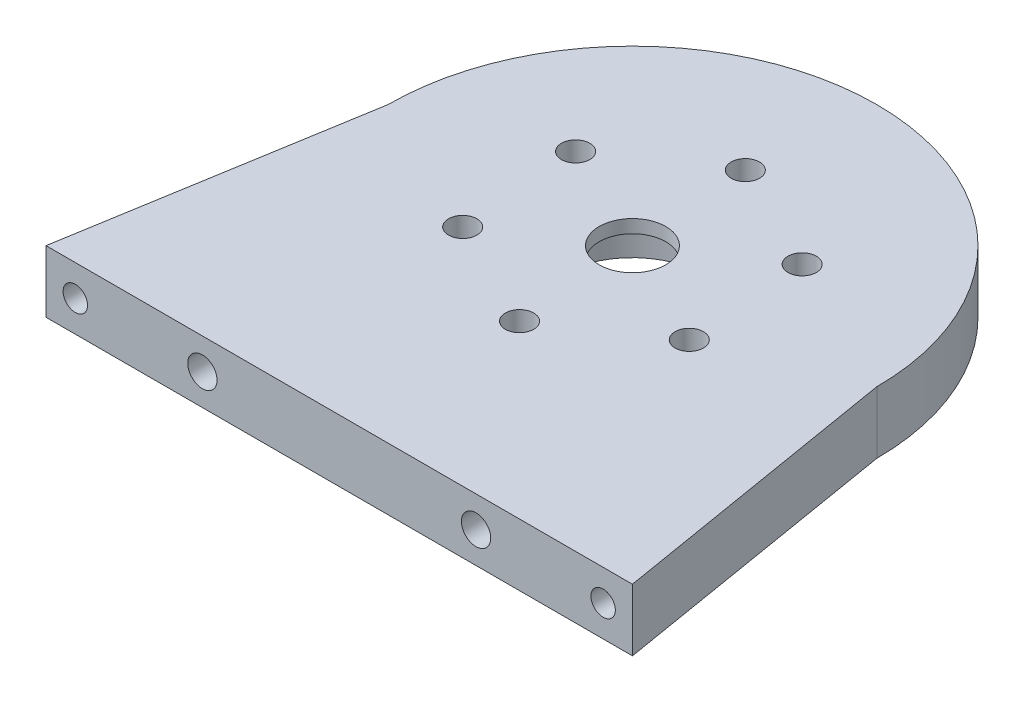
ISO-10303-21;
HEADER;
FILE_DESCRIPTION(('STEP AP214'),'2;1');
FILE_NAME('part.step','',(''),(''),'','','');
FILE_SCHEMA(('AUTOMOTIVE_DESIGN { 1 0 10303 214 1 1 1 1 }'));
ENDSEC;
DATA;
#1=APPLICATION_CONTEXT('core data for automotive mechanical design processes');
#2=APPLICATION_PROTOCOL_DEFINITION('international standard','automotive_design',2000,#1);
#3=PRODUCT_CONTEXT('',#1,'mechanical');
#4=PRODUCT('Part','Part','',(#3));
#5=PRODUCT_RELATED_PRODUCT_CATEGORY('part','',(#4));
#6=PRODUCT_DEFINITION_FORMATION('','',#4);
#7=PRODUCT_DEFINITION_CONTEXT('part definition',#1,'design');
#8=PRODUCT_DEFINITION('design','',#6,#7);
#9=PRODUCT_DEFINITION_SHAPE('','',#8);
#10=(LENGTH_UNIT() NAMED_UNIT(*) SI_UNIT(.MILLI.,.METRE.));
#11=(NAMED_UNIT(*) PLANE_ANGLE_UNIT() SI_UNIT($,.RADIAN.));
#12=(NAMED_UNIT(*) SI_UNIT($,.STERADIAN.) SOLID_ANGLE_UNIT());
#13=UNCERTAINTY_MEASURE_WITH_UNIT(LENGTH_MEASURE(1.E-05),#10,'distance_accuracy_value','');
#14=(GEOMETRIC_REPRESENTATION_CONTEXT(3) GLOBAL_UNCERTAINTY_ASSIGNED_CONTEXT((#13)) GLOBAL_UNIT_ASSIGNED_CONTEXT((#10,
#11,#12)) REPRESENTATION_CONTEXT('',''));
#15=CARTESIAN_POINT('',(0.,0.,0.));
#16=DIRECTION('',(0.,0.,1.));
#17=DIRECTION('',(1.,0.,0.));
#18=AXIS2_PLACEMENT_3D('',#15,#16,#17);
#19=CARTESIAN_POINT('',(152.4,3.175,336.55));
#20=DIRECTION('',(0.,-1.,0.));
#21=DIRECTION('',(0.,0.,-1.));
#22=AXIS2_PLACEMENT_3D('',#19,#20,#21);
#23=CYLINDRICAL_SURFACE('',#22,3.4);
#24=CARTESIAN_POINT('',(152.4,3.175,336.55));
#25=DIRECTION('',(0.,1.,0.));
#26=DIRECTION('',(0.,0.,1.));
#27=AXIS2_PLACEMENT_3D('',#24,#25,#26);
#28=CIRCLE('',#27,3.4);
#29=CARTESIAN_POINT('',(152.4,3.175,339.95));
#30=VERTEX_POINT('',#29);
#31=EDGE_CURVE('E139',#30,#30,#28,.T.);
#32=ORIENTED_EDGE('',*,*,#31,.T.);
#33=EDGE_LOOP('',(#32));
#34=FACE_BOUND('',#33,.T.);
#35=CARTESIAN_POINT('',(152.4,1.825,336.55));
#36=DIRECTION('',(0.,-1.,0.));
#37=DIRECTION('',(0.,0.,-1.));
#38=AXIS2_PLACEMENT_3D('',#35,#36,#37);
#39=CIRCLE('',#38,3.4);
#40=CARTESIAN_POINT('',(152.4,1.825,333.15));
#41=VERTEX_POINT('',#40);
#42=EDGE_CURVE('E43',#41,#41,#39,.T.);
#43=ORIENTED_EDGE('',*,*,#42,.T.);
#44=EDGE_LOOP('',(#43));
#45=FACE_BOUND('',#44,.T.);
#46=ADVANCED_FACE('F39',(#34,#45),#23,.F.);
#47=CARTESIAN_POINT('',(122.4,3.175,366.55));
#48=DIRECTION('',(0.986393923832144,0.,0.164398987305357));
#49=DIRECTION('',(0.164398987305357,0.,-0.986393923832144));
#50=AXIS2_PLACEMENT_3D('',#47,#48,#49);
#51=PLANE('',#50);
#52=DIRECTION('',(-0.164398987305357,0.,0.986393923832144));
#53=VECTOR('',#52,1.);
#54=CARTESIAN_POINT('',(122.4,-3.175,366.55));
#55=LINE('',#54,#53);
#56=CARTESIAN_POINT('',(127.4,-3.175,336.55));
#57=VERTEX_POINT('',#56);
#58=CARTESIAN_POINT('',(122.4,-3.175,366.55));
#59=VERTEX_POINT('',#58);
#60=EDGE_CURVE('E104',#57,#59,#55,.T.);
#61=ORIENTED_EDGE('',*,*,#60,.T.);
#62=DIRECTION('',(0.,-1.,0.));
#63=VECTOR('',#62,1.);
#64=CARTESIAN_POINT('',(122.4,3.175,366.55));
#65=LINE('',#64,#63);
#66=CARTESIAN_POINT('',(122.4,3.175,366.55));
#67=VERTEX_POINT('',#66);
#68=EDGE_CURVE('E11',#67,#59,#65,.T.);
#69=ORIENTED_EDGE('',*,*,#68,.F.);
#70=DIRECTION('',(-0.164398987305357,0.,0.986393923832144));
#71=VECTOR('',#70,1.);
#72=CARTESIAN_POINT('',(122.4,3.175,366.55));
#73=LINE('',#72,#71);
#74=CARTESIAN_POINT('',(127.4,3.175,336.55));
#75=VERTEX_POINT('',#74);
#76=EDGE_CURVE('E59',#75,#67,#73,.T.);
#77=ORIENTED_EDGE('',*,*,#76,.F.);
#78=DIRECTION('',(0.,-1.,0.));
#79=VECTOR('',#78,1.);
#80=CARTESIAN_POINT('',(127.4,3.175,336.55));
#81=LINE('',#80,#79);
#82=EDGE_CURVE('E77',#75,#57,#81,.T.);
#83=ORIENTED_EDGE('',*,*,#82,.T.);
#84=EDGE_LOOP('',(#61,#69,#77,#83));
#85=FACE_BOUND('',#84,.T.);
#86=ADVANCED_FACE('F41',(#85),#51,.F.);
#87=CARTESIAN_POINT('',(182.4,3.175,366.55));
#88=DIRECTION('',(0.,0.,-1.));
#89=DIRECTION('',(-1.,0.,0.));
#90=AXIS2_PLACEMENT_3D('',#87,#88,#89);
#91=PLANE('',#90);
#92=CARTESIAN_POINT('',(138.4,0.,366.55));
#93=DIRECTION('',(0.,0.,1.));
#94=DIRECTION('',(1.,0.,0.));
#95=AXIS2_PLACEMENT_3D('',#92,#93,#94);
#96=CIRCLE('',#95,1.5);
#97=CARTESIAN_POINT('',(139.9,0.,366.55));
#98=VERTEX_POINT('',#97);
#99=EDGE_CURVE('E277',#98,#98,#96,.T.);
#100=ORIENTED_EDGE('',*,*,#99,.F.);
#101=EDGE_LOOP('',(#100));
#102=FACE_BOUND('',#101,.T.);
#103=CARTESIAN_POINT('',(166.4,0.,366.55));
#104=DIRECTION('',(0.,0.,1.));
#105=DIRECTION('',(1.,0.,0.));
#106=AXIS2_PLACEMENT_3D('',#103,#104,#105);
#107=CIRCLE('',#106,1.5);
#108=CARTESIAN_POINT('',(167.9,0.,366.55));
#109=VERTEX_POINT('',#108);
#110=EDGE_CURVE('E288',#109,#109,#107,.T.);
#111=ORIENTED_EDGE('',*,*,#110,.F.);
#112=EDGE_LOOP('',(#111));
#113=FACE_BOUND('',#112,.T.);
#114=CARTESIAN_POINT('',(125.4,0.,366.55));
#115=DIRECTION('',(0.,0.,1.));
#116=DIRECTION('',(1.,0.,0.));
#117=AXIS2_PLACEMENT_3D('',#114,#115,#116);
#118=CIRCLE('',#117,1.25);
#119=CARTESIAN_POINT('',(126.65,0.,366.55));
#120=VERTEX_POINT('',#119);
#121=EDGE_CURVE('E257',#120,#120,#118,.T.);
#122=ORIENTED_EDGE('',*,*,#121,.F.);
#123=EDGE_LOOP('',(#122));
#124=FACE_BOUND('',#123,.T.);
#125=CARTESIAN_POINT('',(179.4,0.,366.55));
#126=DIRECTION('',(0.,0.,1.));
#127=DIRECTION('',(1.,0.,0.));
#128=AXIS2_PLACEMENT_3D('',#125,#126,#127);
#129=CIRCLE('',#128,1.25);
#130=CARTESIAN_POINT('',(180.65,0.,366.55));
#131=VERTEX_POINT('',#130);
#132=EDGE_CURVE('E274',#131,#131,#129,.T.);
#133=ORIENTED_EDGE('',*,*,#132,.F.);
#134=EDGE_LOOP('',(#133));
#135=FACE_BOUND('',#134,.T.);
#136=DIRECTION('',(1.,0.,0.));
#137=VECTOR('',#136,1.);
#138=CARTESIAN_POINT('',(182.4,-3.175,366.55));
#139=LINE('',#138,#137);
#140=CARTESIAN_POINT('',(182.4,-3.175,366.55));
#141=VERTEX_POINT('',#140);
#142=EDGE_CURVE('E74',#59,#141,#139,.T.);
#143=ORIENTED_EDGE('',*,*,#142,.T.);
#144=DIRECTION('',(0.,-1.,0.));
#145=VECTOR('',#144,1.);
#146=CARTESIAN_POINT('',(182.4,3.175,366.55));
#147=LINE('',#146,#145);
#148=CARTESIAN_POINT('',(182.4,3.175,366.55));
#149=VERTEX_POINT('',#148);
#150=EDGE_CURVE('E47',#149,#141,#147,.T.);
#151=ORIENTED_EDGE('',*,*,#150,.F.);
#152=DIRECTION('',(1.,0.,0.));
#153=VECTOR('',#152,1.);
#154=CARTESIAN_POINT('',(182.4,3.175,366.55));
#155=LINE('',#154,#153);
#156=EDGE_CURVE('E83',#67,#149,#155,.T.);
#157=ORIENTED_EDGE('',*,*,#156,.F.);
#158=ORIENTED_EDGE('',*,*,#68,.T.);
#159=EDGE_LOOP('',(#143,#151,#157,#158));
#160=FACE_BOUND('',#159,.T.);
#161=ADVANCED_FACE('F173',(#102,#113,#124,#135,#160),#91,.F.);
#162=CARTESIAN_POINT('',(177.4,3.175,336.55));
#163=DIRECTION('',(-0.986393923832144,0.,0.164398987305357));
#164=DIRECTION('',(0.164398987305357,0.,0.986393923832144));
#165=AXIS2_PLACEMENT_3D('',#162,#163,#164);
#166=PLANE('',#165);
#167=DIRECTION('',(-0.164398987305357,0.,-0.986393923832144));
#168=VECTOR('',#167,1.);
#169=CARTESIAN_POINT('',(177.4,-3.175,336.55));
#170=LINE('',#169,#168);
#171=CARTESIAN_POINT('',(177.4,-3.175,336.55));
#172=VERTEX_POINT('',#171);
#173=EDGE_CURVE('E90',#141,#172,#170,.T.);
#174=ORIENTED_EDGE('',*,*,#173,.T.);
#175=DIRECTION('',(0.,-1.,0.));
#176=VECTOR('',#175,1.);
#177=CARTESIAN_POINT('',(177.4,3.175,336.55));
#178=LINE('',#177,#176);
#179=CARTESIAN_POINT('',(177.4,3.175,336.55));
#180=VERTEX_POINT('',#179);
#181=EDGE_CURVE('E93',#180,#172,#178,.T.);
#182=ORIENTED_EDGE('',*,*,#181,.F.);
#183=DIRECTION('',(-0.164398987305357,0.,-0.986393923832144));
#184=VECTOR('',#183,1.);
#185=CARTESIAN_POINT('',(177.4,3.175,336.55));
#186=LINE('',#185,#184);
#187=EDGE_CURVE('E112',#149,#180,#186,.T.);
#188=ORIENTED_EDGE('',*,*,#187,.F.);
#189=ORIENTED_EDGE('',*,*,#150,.T.);
#190=EDGE_LOOP('',(#174,#182,#188,#189));
#191=FACE_BOUND('',#190,.T.);
#192=ADVANCED_FACE('F87',(#191),#166,.F.);
#193=CARTESIAN_POINT('',(0.,3.175,0.));
#194=DIRECTION('',(0.,-1.,0.));
#195=DIRECTION('',(0.,0.,-1.));
#196=AXIS2_PLACEMENT_3D('',#193,#194,#195);
#197=PLANE('',#196);
#198=CARTESIAN_POINT('',(153.315477464095,3.175,349.016430965306));
#199=DIRECTION('',(0.,1.,0.));
#200=DIRECTION('',(0.,0.,1.));
#201=AXIS2_PLACEMENT_3D('',#198,#199,#200);
#202=CIRCLE('',#201,1.45000000000001);
#203=CARTESIAN_POINT('',(153.315477464095,3.175,350.466430965306));
#204=VERTEX_POINT('',#203);
#205=EDGE_CURVE('E107',#204,#204,#202,.T.);
#206=ORIENTED_EDGE('',*,*,#205,.F.);
#207=EDGE_LOOP('',(#206));
#208=FACE_BOUND('',#207,.T.);
#209=CARTESIAN_POINT('',(142.061492821568,3.175,343.576042223152));
#210=DIRECTION('',(0.,1.,0.));
#211=DIRECTION('',(0.,0.,1.));
#212=AXIS2_PLACEMENT_3D('',#209,#210,#211);
#213=CIRCLE('',#212,1.45000000000001);
#214=CARTESIAN_POINT('',(142.061492821568,3.175,345.026042223152));
#215=VERTEX_POINT('',#214);
#216=EDGE_CURVE('E155',#215,#215,#213,.T.);
#217=ORIENTED_EDGE('',*,*,#216,.F.);
#218=EDGE_LOOP('',(#217));
#219=FACE_BOUND('',#218,.T.);
#220=CARTESIAN_POINT('',(141.146015357473,3.175,331.109611257846));
#221=DIRECTION('',(0.,1.,0.));
#222=DIRECTION('',(0.,0.,1.));
#223=AXIS2_PLACEMENT_3D('',#220,#221,#222);
#224=CIRCLE('',#223,1.45000000000001);
#225=CARTESIAN_POINT('',(141.146015357473,3.175,332.559611257846));
#226=VERTEX_POINT('',#225);
#227=EDGE_CURVE('E154',#226,#226,#224,.T.);
#228=ORIENTED_EDGE('',*,*,#227,.F.);
#229=EDGE_LOOP('',(#228));
#230=FACE_BOUND('',#229,.T.);
#231=CARTESIAN_POINT('',(151.484522535905,3.175,324.083569034694));
#232=DIRECTION('',(0.,1.,0.));
#233=DIRECTION('',(0.,0.,1.));
#234=AXIS2_PLACEMENT_3D('',#231,#232,#233);
#235=CIRCLE('',#234,1.45000000000001);
#236=CARTESIAN_POINT('',(151.484522535905,3.175,325.533569034694));
#237=VERTEX_POINT('',#236);
#238=EDGE_CURVE('E148',#237,#237,#235,.T.);
#239=ORIENTED_EDGE('',*,*,#238,.F.);
#240=EDGE_LOOP('',(#239));
#241=FACE_BOUND('',#240,.T.);
#242=CARTESIAN_POINT('',(162.738507178432,3.175,329.523957776848));
#243=DIRECTION('',(0.,1.,0.));
#244=DIRECTION('',(0.,0.,1.));
#245=AXIS2_PLACEMENT_3D('',#242,#243,#244);
#246=CIRCLE('',#245,1.45000000000001);
#247=CARTESIAN_POINT('',(162.738507178432,3.175,330.973957776848));
#248=VERTEX_POINT('',#247);
#249=EDGE_CURVE('E142',#248,#248,#246,.T.);
#250=ORIENTED_EDGE('',*,*,#249,.F.);
#251=EDGE_LOOP('',(#250));
#252=FACE_BOUND('',#251,.T.);
#253=ORIENTED_EDGE('',*,*,#31,.F.);
#254=EDGE_LOOP('',(#253));
#255=FACE_BOUND('',#254,.T.);
#256=CARTESIAN_POINT('',(163.653984642527,3.175,341.990388742154));
#257=DIRECTION('',(0.,1.,0.));
#258=DIRECTION('',(0.,0.,1.));
#259=AXIS2_PLACEMENT_3D('',#256,#257,#258);
#260=CIRCLE('',#259,1.45000000000001);
#261=CARTESIAN_POINT('',(163.653984642527,3.175,343.440388742154));
#262=VERTEX_POINT('',#261);
#263=EDGE_CURVE('E102',#262,#262,#260,.T.);
#264=ORIENTED_EDGE('',*,*,#263,.F.);
#265=EDGE_LOOP('',(#264));
#266=FACE_BOUND('',#265,.T.);
#267=ORIENTED_EDGE('',*,*,#187,.T.);
#268=CARTESIAN_POINT('',(152.4,3.175,336.55));
#269=DIRECTION('',(0.,1.,0.));
#270=DIRECTION('',(0.,0.,1.));
#271=AXIS2_PLACEMENT_3D('',#268,#269,#270);
#272=CIRCLE('',#271,25.);
#273=EDGE_CURVE('E103',#180,#75,#272,.T.);
#274=ORIENTED_EDGE('',*,*,#273,.T.);
#275=ORIENTED_EDGE('',*,*,#76,.T.);
#276=ORIENTED_EDGE('',*,*,#156,.T.);
#277=EDGE_LOOP('',(#267,#274,#275,#276));
#278=FACE_BOUND('',#277,.T.);
#279=ADVANCED_FACE('F161',(#208,#219,#230,#241,#252,#255,#266,#278),#197,.F.);
#280=CARTESIAN_POINT('',(0.,-3.175,0.));
#281=DIRECTION('',(0.,-1.,0.));
#282=DIRECTION('',(0.,0.,-1.));
#283=AXIS2_PLACEMENT_3D('',#280,#281,#282);
#284=PLANE('',#283);
#285=CARTESIAN_POINT('',(152.4,-3.175,336.55));
#286=DIRECTION('',(0.,-1.,0.));
#287=DIRECTION('',(0.,0.,-1.));
#288=AXIS2_PLACEMENT_3D('',#285,#286,#287);
#289=CIRCLE('',#288,7.47500000000001);
#290=CARTESIAN_POINT('',(152.4,-3.175,329.075));
#291=VERTEX_POINT('',#290);
#292=EDGE_CURVE('E221',#291,#291,#289,.T.);
#293=ORIENTED_EDGE('',*,*,#292,.F.);
#294=EDGE_LOOP('',(#293));
#295=FACE_BOUND('',#294,.T.);
#296=CARTESIAN_POINT('',(162.738507178432,-3.175,329.523957776848));
#297=DIRECTION('',(0.,1.,0.));
#298=DIRECTION('',(0.,0.,1.));
#299=AXIS2_PLACEMENT_3D('',#296,#297,#298);
#300=CIRCLE('',#299,2.5);
#301=CARTESIAN_POINT('',(162.738507178432,-3.175,332.023957776848));
#302=VERTEX_POINT('',#301);
#303=EDGE_CURVE('E230',#302,#302,#300,.T.);
#304=ORIENTED_EDGE('',*,*,#303,.T.);
#305=EDGE_LOOP('',(#304));
#306=FACE_BOUND('',#305,.T.);
#307=CARTESIAN_POINT('',(151.484522535905,-3.175,324.083569034694));
#308=DIRECTION('',(0.,1.,0.));
#309=DIRECTION('',(0.,0.,1.));
#310=AXIS2_PLACEMENT_3D('',#307,#308,#309);
#311=CIRCLE('',#310,2.5);
#312=CARTESIAN_POINT('',(151.484522535905,-3.175,326.583569034694));
#313=VERTEX_POINT('',#312);
#314=EDGE_CURVE('E231',#313,#313,#311,.T.);
#315=ORIENTED_EDGE('',*,*,#314,.T.);
#316=EDGE_LOOP('',(#315));
#317=FACE_BOUND('',#316,.T.);
#318=CARTESIAN_POINT('',(141.146015357473,-3.175,331.109611257846));
#319=DIRECTION('',(0.,1.,0.));
#320=DIRECTION('',(0.,0.,1.));
#321=AXIS2_PLACEMENT_3D('',#318,#319,#320);
#322=CIRCLE('',#321,2.5);
#323=CARTESIAN_POINT('',(141.146015357473,-3.175,333.609611257846));
#324=VERTEX_POINT('',#323);
#325=EDGE_CURVE('E240',#324,#324,#322,.T.);
#326=ORIENTED_EDGE('',*,*,#325,.T.);
#327=EDGE_LOOP('',(#326));
#328=FACE_BOUND('',#327,.T.);
#329=CARTESIAN_POINT('',(142.061492821568,-3.175,343.576042223152));
#330=DIRECTION('',(0.,1.,0.));
#331=DIRECTION('',(0.,0.,1.));
#332=AXIS2_PLACEMENT_3D('',#329,#330,#331);
#333=CIRCLE('',#332,2.5);
#334=CARTESIAN_POINT('',(142.061492821568,-3.175,346.076042223152));
#335=VERTEX_POINT('',#334);
#336=EDGE_CURVE('E241',#335,#335,#333,.T.);
#337=ORIENTED_EDGE('',*,*,#336,.T.);
#338=EDGE_LOOP('',(#337));
#339=FACE_BOUND('',#338,.T.);
#340=CARTESIAN_POINT('',(153.315477464095,-3.175,349.016430965306));
#341=DIRECTION('',(0.,1.,0.));
#342=DIRECTION('',(0.,0.,1.));
#343=AXIS2_PLACEMENT_3D('',#340,#341,#342);
#344=CIRCLE('',#343,2.5);
#345=CARTESIAN_POINT('',(153.315477464095,-3.175,351.516430965306));
#346=VERTEX_POINT('',#345);
#347=EDGE_CURVE('E244',#346,#346,#344,.T.);
#348=ORIENTED_EDGE('',*,*,#347,.T.);
#349=EDGE_LOOP('',(#348));
#350=FACE_BOUND('',#349,.T.);
#351=CARTESIAN_POINT('',(163.653984642527,-3.175,341.990388742154));
#352=DIRECTION('',(0.,1.,0.));
#353=DIRECTION('',(0.,0.,1.));
#354=AXIS2_PLACEMENT_3D('',#351,#352,#353);
#355=CIRCLE('',#354,2.5);
#356=CARTESIAN_POINT('',(163.653984642527,-3.175,344.490388742154));
#357=VERTEX_POINT('',#356);
#358=EDGE_CURVE('E247',#357,#357,#355,.T.);
#359=ORIENTED_EDGE('',*,*,#358,.T.);
#360=EDGE_LOOP('',(#359));
#361=FACE_BOUND('',#360,.T.);
#362=ORIENTED_EDGE('',*,*,#60,.F.);
#363=CARTESIAN_POINT('',(152.4,-3.175,336.55));
#364=DIRECTION('',(0.,1.,0.));
#365=DIRECTION('',(0.,0.,1.));
#366=AXIS2_PLACEMENT_3D('',#363,#364,#365);
#367=CIRCLE('',#366,25.);
#368=EDGE_CURVE('E100',#172,#57,#367,.T.);
#369=ORIENTED_EDGE('',*,*,#368,.F.);
#370=ORIENTED_EDGE('',*,*,#173,.F.);
#371=ORIENTED_EDGE('',*,*,#142,.F.);
#372=EDGE_LOOP('',(#362,#369,#370,#371));
#373=FACE_BOUND('',#372,.T.);
#374=ADVANCED_FACE('F101',(#295,#306,#317,#328,#339,#350,#361,#373),#284,.T.);
#375=CARTESIAN_POINT('',(152.4,3.175,336.55));
#376=DIRECTION('',(0.,-1.,0.));
#377=DIRECTION('',(0.,0.,-1.));
#378=AXIS2_PLACEMENT_3D('',#375,#376,#377);
#379=CYLINDRICAL_SURFACE('',#378,25.);
#380=ORIENTED_EDGE('',*,*,#368,.T.);
#381=ORIENTED_EDGE('',*,*,#82,.F.);
#382=ORIENTED_EDGE('',*,*,#273,.F.);
#383=ORIENTED_EDGE('',*,*,#181,.T.);
#384=EDGE_LOOP('',(#380,#381,#382,#383));
#385=FACE_BOUND('',#384,.T.);
#386=ADVANCED_FACE('F96',(#385),#379,.T.);
#387=CARTESIAN_POINT('',(163.653984642527,3.175,341.990388742154));
#388=DIRECTION('',(0.,-1.,0.));
#389=DIRECTION('',(0.,0.,-1.));
#390=AXIS2_PLACEMENT_3D('',#387,#388,#389);
#391=CYLINDRICAL_SURFACE('',#390,1.45000000000001);
#392=CARTESIAN_POINT('',(163.653984642527,-0.575,341.990388742154));
#393=DIRECTION('',(0.,1.,0.));
#394=DIRECTION('',(0.,0.,1.));
#395=AXIS2_PLACEMENT_3D('',#392,#393,#394);
#396=CIRCLE('',#395,1.45000000000001);
#397=CARTESIAN_POINT('',(163.653984642527,-0.575,343.440388742154));
#398=VERTEX_POINT('',#397);
#399=EDGE_CURVE('E134',#398,#398,#396,.T.);
#400=ORIENTED_EDGE('',*,*,#399,.F.);
#401=EDGE_LOOP('',(#400));
#402=FACE_BOUND('',#401,.T.);
#403=ORIENTED_EDGE('',*,*,#263,.T.);
#404=EDGE_LOOP('',(#403));
#405=FACE_BOUND('',#404,.T.);
#406=ADVANCED_FACE('F214',(#402,#405),#391,.F.);
#407=CARTESIAN_POINT('',(162.738507178432,3.175,329.523957776848));
#408=DIRECTION('',(0.,-1.,0.));
#409=DIRECTION('',(0.,0.,-1.));
#410=AXIS2_PLACEMENT_3D('',#407,#408,#409);
#411=CYLINDRICAL_SURFACE('',#410,1.45000000000001);
#412=CARTESIAN_POINT('',(162.738507178432,-0.575,329.523957776848));
#413=DIRECTION('',(0.,1.,0.));
#414=DIRECTION('',(0.,0.,1.));
#415=AXIS2_PLACEMENT_3D('',#412,#413,#414);
#416=CIRCLE('',#415,1.45000000000001);
#417=CARTESIAN_POINT('',(162.738507178432,-0.575,330.973957776848));
#418=VERTEX_POINT('',#417);
#419=EDGE_CURVE('E131',#418,#418,#416,.T.);
#420=ORIENTED_EDGE('',*,*,#419,.F.);
#421=EDGE_LOOP('',(#420));
#422=FACE_BOUND('',#421,.T.);
#423=ORIENTED_EDGE('',*,*,#249,.T.);
#424=EDGE_LOOP('',(#423));
#425=FACE_BOUND('',#424,.T.);
#426=ADVANCED_FACE('F195',(#422,#425),#411,.F.);
#427=CARTESIAN_POINT('',(151.484522535905,3.175,324.083569034694));
#428=DIRECTION('',(0.,-1.,0.));
#429=DIRECTION('',(0.,0.,-1.));
#430=AXIS2_PLACEMENT_3D('',#427,#428,#429);
#431=CYLINDRICAL_SURFACE('',#430,1.45000000000001);
#432=CARTESIAN_POINT('',(151.484522535905,-0.575,324.083569034694));
#433=DIRECTION('',(0.,1.,0.));
#434=DIRECTION('',(0.,0.,1.));
#435=AXIS2_PLACEMENT_3D('',#432,#433,#434);
#436=CIRCLE('',#435,1.45000000000001);
#437=CARTESIAN_POINT('',(151.484522535905,-0.575,325.533569034694));
#438=VERTEX_POINT('',#437);
#439=EDGE_CURVE('E126',#438,#438,#436,.T.);
#440=ORIENTED_EDGE('',*,*,#439,.F.);
#441=EDGE_LOOP('',(#440));
#442=FACE_BOUND('',#441,.T.);
#443=ORIENTED_EDGE('',*,*,#238,.T.);
#444=EDGE_LOOP('',(#443));
#445=FACE_BOUND('',#444,.T.);
#446=ADVANCED_FACE('F163',(#442,#445),#431,.F.);
#447=CARTESIAN_POINT('',(141.146015357473,3.175,331.109611257846));
#448=DIRECTION('',(0.,-1.,0.));
#449=DIRECTION('',(0.,0.,-1.));
#450=AXIS2_PLACEMENT_3D('',#447,#448,#449);
#451=CYLINDRICAL_SURFACE('',#450,1.45000000000001);
#452=CARTESIAN_POINT('',(141.146015357473,-0.575,331.109611257846));
#453=DIRECTION('',(0.,1.,0.));
#454=DIRECTION('',(0.,0.,1.));
#455=AXIS2_PLACEMENT_3D('',#452,#453,#454);
#456=CIRCLE('',#455,1.45000000000001);
#457=CARTESIAN_POINT('',(141.146015357473,-0.575,332.559611257846));
#458=VERTEX_POINT('',#457);
#459=EDGE_CURVE('E129',#458,#458,#456,.T.);
#460=ORIENTED_EDGE('',*,*,#459,.F.);
#461=EDGE_LOOP('',(#460));
#462=FACE_BOUND('',#461,.T.);
#463=ORIENTED_EDGE('',*,*,#227,.T.);
#464=EDGE_LOOP('',(#463));
#465=FACE_BOUND('',#464,.T.);
#466=ADVANCED_FACE('F205',(#462,#465),#451,.F.);
#467=CARTESIAN_POINT('',(142.061492821568,3.175,343.576042223152));
#468=DIRECTION('',(0.,-1.,0.));
#469=DIRECTION('',(0.,0.,-1.));
#470=AXIS2_PLACEMENT_3D('',#467,#468,#469);
#471=CYLINDRICAL_SURFACE('',#470,1.45000000000001);
#472=CARTESIAN_POINT('',(142.061492821568,-0.575,343.576042223152));
#473=DIRECTION('',(0.,1.,0.));
#474=DIRECTION('',(0.,0.,1.));
#475=AXIS2_PLACEMENT_3D('',#472,#473,#474);
#476=CIRCLE('',#475,1.45000000000001);
#477=CARTESIAN_POINT('',(142.061492821568,-0.575,345.026042223152));
#478=VERTEX_POINT('',#477);
#479=EDGE_CURVE('E124',#478,#478,#476,.T.);
#480=ORIENTED_EDGE('',*,*,#479,.F.);
#481=EDGE_LOOP('',(#480));
#482=FACE_BOUND('',#481,.T.);
#483=ORIENTED_EDGE('',*,*,#216,.T.);
#484=EDGE_LOOP('',(#483));
#485=FACE_BOUND('',#484,.T.);
#486=ADVANCED_FACE('F199',(#482,#485),#471,.F.);
#487=CARTESIAN_POINT('',(153.315477464095,3.175,349.016430965306));
#488=DIRECTION('',(0.,-1.,0.));
#489=DIRECTION('',(0.,0.,-1.));
#490=AXIS2_PLACEMENT_3D('',#487,#488,#489);
#491=CYLINDRICAL_SURFACE('',#490,1.45000000000001);
#492=CARTESIAN_POINT('',(153.315477464095,-0.575,349.016430965306));
#493=DIRECTION('',(0.,1.,0.));
#494=DIRECTION('',(0.,0.,1.));
#495=AXIS2_PLACEMENT_3D('',#492,#493,#494);
#496=CIRCLE('',#495,1.45000000000001);
#497=CARTESIAN_POINT('',(153.315477464095,-0.575,350.466430965306));
#498=VERTEX_POINT('',#497);
#499=EDGE_CURVE('E119',#498,#498,#496,.T.);
#500=ORIENTED_EDGE('',*,*,#499,.F.);
#501=EDGE_LOOP('',(#500));
#502=FACE_BOUND('',#501,.T.);
#503=ORIENTED_EDGE('',*,*,#205,.T.);
#504=EDGE_LOOP('',(#503));
#505=FACE_BOUND('',#504,.T.);
#506=ADVANCED_FACE('F198',(#502,#505),#491,.F.);
#507=CARTESIAN_POINT('',(153.315477464095,-0.575,349.016430965306));
#508=DIRECTION('',(0.,-1.,0.));
#509=DIRECTION('',(0.,0.,-1.));
#510=AXIS2_PLACEMENT_3D('',#507,#508,#509);
#511=CYLINDRICAL_SURFACE('',#510,2.5);
#512=CARTESIAN_POINT('',(153.315477464095,-0.575,349.016430965306));
#513=DIRECTION('',(0.,1.,0.));
#514=DIRECTION('',(0.,0.,1.));
#515=AXIS2_PLACEMENT_3D('',#512,#513,#514);
#516=CIRCLE('',#515,2.5);
#517=CARTESIAN_POINT('',(153.315477464095,-0.575,351.516430965306));
#518=VERTEX_POINT('',#517);
#519=EDGE_CURVE('E255',#518,#518,#516,.T.);
#520=ORIENTED_EDGE('',*,*,#519,.T.);
#521=EDGE_LOOP('',(#520));
#522=FACE_BOUND('',#521,.T.);
#523=ORIENTED_EDGE('',*,*,#347,.F.);
#524=EDGE_LOOP('',(#523));
#525=FACE_BOUND('',#524,.T.);
#526=ADVANCED_FACE('F197',(#522,#525),#511,.F.);
#527=CARTESIAN_POINT('',(153.315477464095,-0.575,349.016430965306));
#528=DIRECTION('',(0.,1.,0.));
#529=DIRECTION('',(0.,0.,1.));
#530=AXIS2_PLACEMENT_3D('',#527,#528,#529);
#531=PLANE('',#530);
#532=ORIENTED_EDGE('',*,*,#499,.T.);
#533=EDGE_LOOP('',(#532));
#534=FACE_BOUND('',#533,.T.);
#535=ORIENTED_EDGE('',*,*,#519,.F.);
#536=EDGE_LOOP('',(#535));
#537=FACE_BOUND('',#536,.T.);
#538=ADVANCED_FACE('F348',(#534,#537),#531,.F.);
#539=CARTESIAN_POINT('',(142.061492821568,-0.575,343.576042223152));
#540=DIRECTION('',(0.,-1.,0.));
#541=DIRECTION('',(0.,0.,-1.));
#542=AXIS2_PLACEMENT_3D('',#539,#540,#541);
#543=CYLINDRICAL_SURFACE('',#542,2.5);
#544=CARTESIAN_POINT('',(142.061492821568,-0.575,343.576042223152));
#545=DIRECTION('',(0.,1.,0.));
#546=DIRECTION('',(0.,0.,1.));
#547=AXIS2_PLACEMENT_3D('',#544,#545,#546);
#548=CIRCLE('',#547,2.5);
#549=CARTESIAN_POINT('',(142.061492821568,-0.575,346.076042223152));
#550=VERTEX_POINT('',#549);
#551=EDGE_CURVE('E267',#550,#550,#548,.T.);
#552=ORIENTED_EDGE('',*,*,#551,.T.);
#553=EDGE_LOOP('',(#552));
#554=FACE_BOUND('',#553,.T.);
#555=ORIENTED_EDGE('',*,*,#336,.F.);
#556=EDGE_LOOP('',(#555));
#557=FACE_BOUND('',#556,.T.);
#558=ADVANCED_FACE('F349',(#554,#557),#543,.F.);
#559=CARTESIAN_POINT('',(142.061492821568,-0.575,343.576042223152));
#560=DIRECTION('',(0.,1.,0.));
#561=DIRECTION('',(0.,0.,1.));
#562=AXIS2_PLACEMENT_3D('',#559,#560,#561);
#563=PLANE('',#562);
#564=ORIENTED_EDGE('',*,*,#479,.T.);
#565=EDGE_LOOP('',(#564));
#566=FACE_BOUND('',#565,.T.);
#567=ORIENTED_EDGE('',*,*,#551,.F.);
#568=EDGE_LOOP('',(#567));
#569=FACE_BOUND('',#568,.T.);
#570=ADVANCED_FACE('F355',(#566,#569),#563,.F.);
#571=CARTESIAN_POINT('',(141.146015357473,-0.575,331.109611257846));
#572=DIRECTION('',(0.,-1.,0.));
#573=DIRECTION('',(0.,0.,-1.));
#574=AXIS2_PLACEMENT_3D('',#571,#572,#573);
#575=CYLINDRICAL_SURFACE('',#574,2.5);
#576=CARTESIAN_POINT('',(141.146015357473,-0.575,331.109611257846));
#577=DIRECTION('',(0.,1.,0.));
#578=DIRECTION('',(0.,0.,1.));
#579=AXIS2_PLACEMENT_3D('',#576,#577,#578);
#580=CIRCLE('',#579,2.5);
#581=CARTESIAN_POINT('',(141.146015357473,-0.575,333.609611257846));
#582=VERTEX_POINT('',#581);
#583=EDGE_CURVE('E262',#582,#582,#580,.T.);
#584=ORIENTED_EDGE('',*,*,#583,.T.);
#585=EDGE_LOOP('',(#584));
#586=FACE_BOUND('',#585,.T.);
#587=ORIENTED_EDGE('',*,*,#325,.F.);
#588=EDGE_LOOP('',(#587));
#589=FACE_BOUND('',#588,.T.);
#590=ADVANCED_FACE('F356',(#586,#589),#575,.F.);
#591=CARTESIAN_POINT('',(141.146015357473,-0.575,331.109611257846));
#592=DIRECTION('',(0.,1.,0.));
#593=DIRECTION('',(0.,0.,1.));
#594=AXIS2_PLACEMENT_3D('',#591,#592,#593);
#595=PLANE('',#594);
#596=ORIENTED_EDGE('',*,*,#459,.T.);
#597=EDGE_LOOP('',(#596));
#598=FACE_BOUND('',#597,.T.);
#599=ORIENTED_EDGE('',*,*,#583,.F.);
#600=EDGE_LOOP('',(#599));
#601=FACE_BOUND('',#600,.T.);
#602=ADVANCED_FACE('F365',(#598,#601),#595,.F.);
#603=CARTESIAN_POINT('',(151.484522535905,-0.575,324.083569034694));
#604=DIRECTION('',(0.,-1.,0.));
#605=DIRECTION('',(0.,0.,-1.));
#606=AXIS2_PLACEMENT_3D('',#603,#604,#605);
#607=CYLINDRICAL_SURFACE('',#606,2.5);
#608=CARTESIAN_POINT('',(151.484522535905,-0.575,324.083569034694));
#609=DIRECTION('',(0.,1.,0.));
#610=DIRECTION('',(0.,0.,1.));
#611=AXIS2_PLACEMENT_3D('',#608,#609,#610);
#612=CIRCLE('',#611,2.5);
#613=CARTESIAN_POINT('',(151.484522535905,-0.575,326.583569034694));
#614=VERTEX_POINT('',#613);
#615=EDGE_CURVE('E256',#614,#614,#612,.T.);
#616=ORIENTED_EDGE('',*,*,#615,.T.);
#617=EDGE_LOOP('',(#616));
#618=FACE_BOUND('',#617,.T.);
#619=ORIENTED_EDGE('',*,*,#314,.F.);
#620=EDGE_LOOP('',(#619));
#621=FACE_BOUND('',#620,.T.);
#622=ADVANCED_FACE('F366',(#618,#621),#607,.F.);
#623=CARTESIAN_POINT('',(151.484522535905,-0.575,324.083569034694));
#624=DIRECTION('',(0.,1.,0.));
#625=DIRECTION('',(0.,0.,1.));
#626=AXIS2_PLACEMENT_3D('',#623,#624,#625);
#627=PLANE('',#626);
#628=ORIENTED_EDGE('',*,*,#439,.T.);
#629=EDGE_LOOP('',(#628));
#630=FACE_BOUND('',#629,.T.);
#631=ORIENTED_EDGE('',*,*,#615,.F.);
#632=EDGE_LOOP('',(#631));
#633=FACE_BOUND('',#632,.T.);
#634=ADVANCED_FACE('F369',(#630,#633),#627,.F.);
#635=CARTESIAN_POINT('',(162.738507178432,-0.575,329.523957776848));
#636=DIRECTION('',(0.,-1.,0.));
#637=DIRECTION('',(0.,0.,-1.));
#638=AXIS2_PLACEMENT_3D('',#635,#636,#637);
#639=CYLINDRICAL_SURFACE('',#638,2.5);
#640=CARTESIAN_POINT('',(162.738507178432,-0.575,329.523957776848));
#641=DIRECTION('',(0.,1.,0.));
#642=DIRECTION('',(0.,0.,1.));
#643=AXIS2_PLACEMENT_3D('',#640,#641,#642);
#644=CIRCLE('',#643,2.5);
#645=CARTESIAN_POINT('',(162.738507178432,-0.575,332.023957776848));
#646=VERTEX_POINT('',#645);
#647=EDGE_CURVE('E253',#646,#646,#644,.T.);
#648=ORIENTED_EDGE('',*,*,#647,.T.);
#649=EDGE_LOOP('',(#648));
#650=FACE_BOUND('',#649,.T.);
#651=ORIENTED_EDGE('',*,*,#303,.F.);
#652=EDGE_LOOP('',(#651));
#653=FACE_BOUND('',#652,.T.);
#654=ADVANCED_FACE('F372',(#650,#653),#639,.F.);
#655=CARTESIAN_POINT('',(162.738507178432,-0.575,329.523957776848));
#656=DIRECTION('',(0.,1.,0.));
#657=DIRECTION('',(0.,0.,1.));
#658=AXIS2_PLACEMENT_3D('',#655,#656,#657);
#659=PLANE('',#658);
#660=ORIENTED_EDGE('',*,*,#419,.T.);
#661=EDGE_LOOP('',(#660));
#662=FACE_BOUND('',#661,.T.);
#663=ORIENTED_EDGE('',*,*,#647,.F.);
#664=EDGE_LOOP('',(#663));
#665=FACE_BOUND('',#664,.T.);
#666=ADVANCED_FACE('F377',(#662,#665),#659,.F.);
#667=CARTESIAN_POINT('',(163.653984642527,-0.575,341.990388742154));
#668=DIRECTION('',(0.,-1.,0.));
#669=DIRECTION('',(0.,0.,-1.));
#670=AXIS2_PLACEMENT_3D('',#667,#668,#669);
#671=CYLINDRICAL_SURFACE('',#670,2.5);
#672=CARTESIAN_POINT('',(163.653984642527,-0.575,341.990388742154));
#673=DIRECTION('',(0.,1.,0.));
#674=DIRECTION('',(0.,0.,1.));
#675=AXIS2_PLACEMENT_3D('',#672,#673,#674);
#676=CIRCLE('',#675,2.5);
#677=CARTESIAN_POINT('',(163.653984642527,-0.575,344.490388742154));
#678=VERTEX_POINT('',#677);
#679=EDGE_CURVE('E121',#678,#678,#676,.T.);
#680=ORIENTED_EDGE('',*,*,#679,.T.);
#681=EDGE_LOOP('',(#680));
#682=FACE_BOUND('',#681,.T.);
#683=ORIENTED_EDGE('',*,*,#358,.F.);
#684=EDGE_LOOP('',(#683));
#685=FACE_BOUND('',#684,.T.);
#686=ADVANCED_FACE('F385',(#682,#685),#671,.F.);
#687=CARTESIAN_POINT('',(163.653984642527,-0.575,341.990388742154));
#688=DIRECTION('',(0.,1.,0.));
#689=DIRECTION('',(0.,0.,1.));
#690=AXIS2_PLACEMENT_3D('',#687,#688,#689);
#691=PLANE('',#690);
#692=ORIENTED_EDGE('',*,*,#399,.T.);
#693=EDGE_LOOP('',(#692));
#694=FACE_BOUND('',#693,.T.);
#695=ORIENTED_EDGE('',*,*,#679,.F.);
#696=EDGE_LOOP('',(#695));
#697=FACE_BOUND('',#696,.T.);
#698=ADVANCED_FACE('F339',(#694,#697),#691,.F.);
#699=CARTESIAN_POINT('',(179.4,0.,366.55));
#700=DIRECTION('',(0.,0.,-1.));
#701=DIRECTION('',(-1.,0.,0.));
#702=AXIS2_PLACEMENT_3D('',#699,#700,#701);
#703=CYLINDRICAL_SURFACE('',#702,1.25);
#704=ORIENTED_EDGE('',*,*,#132,.T.);
#705=EDGE_LOOP('',(#704));
#706=FACE_BOUND('',#705,.T.);
#707=CARTESIAN_POINT('',(179.4,0.,357.55));
#708=DIRECTION('',(0.,0.,1.));
#709=DIRECTION('',(1.,0.,0.));
#710=AXIS2_PLACEMENT_3D('',#707,#708,#709);
#711=CIRCLE('',#710,1.25);
#712=CARTESIAN_POINT('',(180.65,0.,357.55));
#713=VERTEX_POINT('',#712);
#714=EDGE_CURVE('E279',#713,#713,#711,.T.);
#715=ORIENTED_EDGE('',*,*,#714,.F.);
#716=EDGE_LOOP('',(#715));
#717=FACE_BOUND('',#716,.T.);
#718=ADVANCED_FACE('F337',(#706,#717),#703,.F.);
#719=CARTESIAN_POINT('',(179.4,0.,357.55));
#720=DIRECTION('',(0.,0.,1.));
#721=DIRECTION('',(1.,0.,0.));
#722=AXIS2_PLACEMENT_3D('',#719,#720,#721);
#723=PLANE('',#722);
#724=ORIENTED_EDGE('',*,*,#714,.T.);
#725=EDGE_LOOP('',(#724));
#726=FACE_BOUND('',#725,.T.);
#727=ADVANCED_FACE('F335',(#726),#723,.T.);
#728=CARTESIAN_POINT('',(125.4,0.,366.55));
#729=DIRECTION('',(0.,0.,-1.));
#730=DIRECTION('',(-1.,0.,0.));
#731=AXIS2_PLACEMENT_3D('',#728,#729,#730);
#732=CYLINDRICAL_SURFACE('',#731,1.25);
#733=ORIENTED_EDGE('',*,*,#121,.T.);
#734=EDGE_LOOP('',(#733));
#735=FACE_BOUND('',#734,.T.);
#736=CARTESIAN_POINT('',(125.4,0.,357.55));
#737=DIRECTION('',(0.,0.,1.));
#738=DIRECTION('',(1.,0.,0.));
#739=AXIS2_PLACEMENT_3D('',#736,#737,#738);
#740=CIRCLE('',#739,1.25);
#741=CARTESIAN_POINT('',(126.65,0.,357.55));
#742=VERTEX_POINT('',#741);
#743=EDGE_CURVE('E283',#742,#742,#740,.T.);
#744=ORIENTED_EDGE('',*,*,#743,.F.);
#745=EDGE_LOOP('',(#744));
#746=FACE_BOUND('',#745,.T.);
#747=ADVANCED_FACE('F329',(#735,#746),#732,.F.);
#748=CARTESIAN_POINT('',(125.4,0.,357.55));
#749=DIRECTION('',(0.,0.,1.));
#750=DIRECTION('',(1.,0.,0.));
#751=AXIS2_PLACEMENT_3D('',#748,#749,#750);
#752=PLANE('',#751);
#753=ORIENTED_EDGE('',*,*,#743,.T.);
#754=EDGE_LOOP('',(#753));
#755=FACE_BOUND('',#754,.T.);
#756=ADVANCED_FACE('F325',(#755),#752,.T.);
#757=CARTESIAN_POINT('',(166.4,0.,366.55));
#758=DIRECTION('',(0.,0.,-1.));
#759=DIRECTION('',(-1.,0.,0.));
#760=AXIS2_PLACEMENT_3D('',#757,#758,#759);
#761=CYLINDRICAL_SURFACE('',#760,1.5);
#762=ORIENTED_EDGE('',*,*,#110,.T.);
#763=EDGE_LOOP('',(#762));
#764=FACE_BOUND('',#763,.T.);
#765=CARTESIAN_POINT('',(166.4,0.,359.55));
#766=DIRECTION('',(0.,0.,1.));
#767=DIRECTION('',(1.,0.,0.));
#768=AXIS2_PLACEMENT_3D('',#765,#766,#767);
#769=CIRCLE('',#768,1.5);
#770=CARTESIAN_POINT('',(167.9,0.,359.55));
#771=VERTEX_POINT('',#770);
#772=EDGE_CURVE('E290',#771,#771,#769,.T.);
#773=ORIENTED_EDGE('',*,*,#772,.F.);
#774=EDGE_LOOP('',(#773));
#775=FACE_BOUND('',#774,.T.);
#776=ADVANCED_FACE('F324',(#764,#775),#761,.F.);
#777=CARTESIAN_POINT('',(166.4,0.,359.55));
#778=DIRECTION('',(0.,0.,1.));
#779=DIRECTION('',(1.,0.,0.));
#780=AXIS2_PLACEMENT_3D('',#777,#778,#779);
#781=PLANE('',#780);
#782=ORIENTED_EDGE('',*,*,#772,.T.);
#783=EDGE_LOOP('',(#782));
#784=FACE_BOUND('',#783,.T.);
#785=ADVANCED_FACE('F318',(#784),#781,.T.);
#786=CARTESIAN_POINT('',(138.4,0.,366.55));
#787=DIRECTION('',(0.,0.,-1.));
#788=DIRECTION('',(-1.,0.,0.));
#789=AXIS2_PLACEMENT_3D('',#786,#787,#788);
#790=CYLINDRICAL_SURFACE('',#789,1.5);
#791=ORIENTED_EDGE('',*,*,#99,.T.);
#792=EDGE_LOOP('',(#791));
#793=FACE_BOUND('',#792,.T.);
#794=CARTESIAN_POINT('',(138.4,0.,359.55));
#795=DIRECTION('',(0.,0.,1.));
#796=DIRECTION('',(1.,0.,0.));
#797=AXIS2_PLACEMENT_3D('',#794,#795,#796);
#798=CIRCLE('',#797,1.5);
#799=CARTESIAN_POINT('',(139.9,0.,359.55));
#800=VERTEX_POINT('',#799);
#801=EDGE_CURVE('E292',#800,#800,#798,.T.);
#802=ORIENTED_EDGE('',*,*,#801,.F.);
#803=EDGE_LOOP('',(#802));
#804=FACE_BOUND('',#803,.T.);
#805=ADVANCED_FACE('F317',(#793,#804),#790,.F.);
#806=CARTESIAN_POINT('',(138.4,0.,359.55));
#807=DIRECTION('',(0.,0.,1.));
#808=DIRECTION('',(1.,0.,0.));
#809=AXIS2_PLACEMENT_3D('',#806,#807,#808);
#810=PLANE('',#809);
#811=ORIENTED_EDGE('',*,*,#801,.T.);
#812=EDGE_LOOP('',(#811));
#813=FACE_BOUND('',#812,.T.);
#814=ADVANCED_FACE('F311',(#813),#810,.T.);
#815=CARTESIAN_POINT('',(152.4,1.825,336.55));
#816=DIRECTION('',(0.,-1.,0.));
#817=DIRECTION('',(0.,0.,-1.));
#818=AXIS2_PLACEMENT_3D('',#815,#816,#817);
#819=CYLINDRICAL_SURFACE('',#818,7.47500000000001);
#820=CARTESIAN_POINT('',(152.4,1.825,336.55));
#821=DIRECTION('',(0.,-1.,0.));
#822=DIRECTION('',(0.,0.,-1.));
#823=AXIS2_PLACEMENT_3D('',#820,#821,#822);
#824=CIRCLE('',#823,7.47500000000001);
#825=CARTESIAN_POINT('',(152.4,1.825,329.075));
#826=VERTEX_POINT('',#825);
#827=EDGE_CURVE('E296',#826,#826,#824,.T.);
#828=ORIENTED_EDGE('',*,*,#827,.F.);
#829=EDGE_LOOP('',(#828));
#830=FACE_BOUND('',#829,.T.);
#831=ORIENTED_EDGE('',*,*,#292,.T.);
#832=EDGE_LOOP('',(#831));
#833=FACE_BOUND('',#832,.T.);
#834=ADVANCED_FACE('F310',(#830,#833),#819,.F.);
#835=CARTESIAN_POINT('',(152.4,1.825,336.55));
#836=DIRECTION('',(0.,-1.,0.));
#837=DIRECTION('',(0.,0.,-1.));
#838=AXIS2_PLACEMENT_3D('',#835,#836,#837);
#839=PLANE('',#838);
#840=ORIENTED_EDGE('',*,*,#42,.F.);
#841=EDGE_LOOP('',(#840));
#842=FACE_BOUND('',#841,.T.);
#843=ORIENTED_EDGE('',*,*,#827,.T.);
#844=EDGE_LOOP('',(#843));
#845=FACE_BOUND('',#844,.T.);
#846=ADVANCED_FACE('F304',(#842,#845),#839,.T.);
#847=CLOSED_SHELL('',(#46,#86,#161,#192,#279,#374,#386,#406,#426,#446,#466,#486,#506,#526,#538,
#558,#570,#590,#602,#622,#634,#654,#666,#686,#698,#718,#727,#747,#756,#776,#785,#805,#814,#834,#846));
#848=MANIFOLD_SOLID_BREP('B2',#847);
#849=ADVANCED_BREP_SHAPE_REPRESENTATION('',(#18,#848),#14);
#850=SHAPE_DEFINITION_REPRESENTATION(#9,#849);
ENDSEC;
END-ISO-10303-21;
